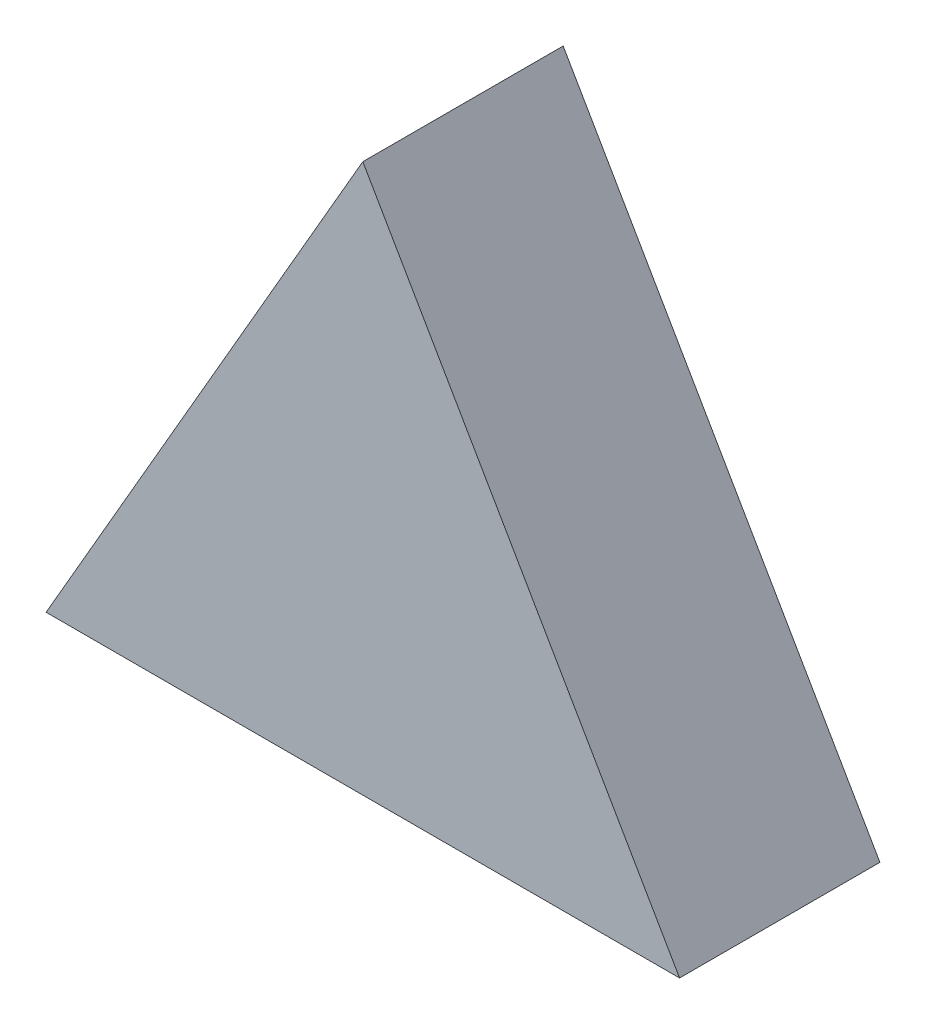
ISO-10303-21;
HEADER;
FILE_DESCRIPTION(('STEP AP214'),'2;1');
FILE_NAME('part.step','',(''),(''),'','','');
FILE_SCHEMA(('AUTOMOTIVE_DESIGN { 1 0 10303 214 1 1 1 1 }'));
ENDSEC;
DATA;
#1=APPLICATION_CONTEXT('core data for automotive mechanical design processes');
#2=APPLICATION_PROTOCOL_DEFINITION('international standard','automotive_design',2000,#1);
#3=PRODUCT_CONTEXT('',#1,'mechanical');
#4=PRODUCT('Part','Part','',(#3));
#5=PRODUCT_RELATED_PRODUCT_CATEGORY('part','',(#4));
#6=PRODUCT_DEFINITION_FORMATION('','',#4);
#7=PRODUCT_DEFINITION_CONTEXT('part definition',#1,'design');
#8=PRODUCT_DEFINITION('design','',#6,#7);
#9=PRODUCT_DEFINITION_SHAPE('','',#8);
#10=(LENGTH_UNIT() NAMED_UNIT(*) SI_UNIT(.MILLI.,.METRE.));
#11=(NAMED_UNIT(*) PLANE_ANGLE_UNIT() SI_UNIT($,.RADIAN.));
#12=(NAMED_UNIT(*) SI_UNIT($,.STERADIAN.) SOLID_ANGLE_UNIT());
#13=UNCERTAINTY_MEASURE_WITH_UNIT(LENGTH_MEASURE(1.E-05),#10,'distance_accuracy_value','');
#14=(GEOMETRIC_REPRESENTATION_CONTEXT(3) GLOBAL_UNCERTAINTY_ASSIGNED_CONTEXT((#13)) GLOBAL_UNIT_ASSIGNED_CONTEXT((#10,
#11,#12)) REPRESENTATION_CONTEXT('',''));
#15=CARTESIAN_POINT('',(0.,0.,0.));
#16=DIRECTION('',(0.,0.,1.));
#17=DIRECTION('',(1.,0.,0.));
#18=AXIS2_PLACEMENT_3D('',#15,#16,#17);
#19=CARTESIAN_POINT('',(101.6,-58.6587873496659,64.262));
#20=DIRECTION('',(-0.866025403784438,-0.5,0.));
#21=DIRECTION('',(0.5,-0.866025403784439,0.));
#22=AXIS2_PLACEMENT_3D('',#19,#20,#21);
#23=PLANE('',#22);
#24=DIRECTION('',(-0.5,0.866025403784438,0.));
#25=VECTOR('',#24,1.);
#26=CARTESIAN_POINT('',(101.6,-58.6587873496659,0.));
#27=LINE('',#26,#25);
#28=CARTESIAN_POINT('',(101.6,-58.6587873496659,0.));
#29=VERTEX_POINT('',#28);
#30=CARTESIAN_POINT('',(0.,117.317574699332,0.));
#31=VERTEX_POINT('',#30);
#32=EDGE_CURVE('E81',#29,#31,#27,.T.);
#33=ORIENTED_EDGE('',*,*,#32,.T.);
#34=DIRECTION('',(0.,0.,-1.));
#35=VECTOR('',#34,1.);
#36=CARTESIAN_POINT('',(0.,117.317574699332,64.262));
#37=LINE('',#36,#35);
#38=CARTESIAN_POINT('',(0.,117.317574699332,64.262));
#39=VERTEX_POINT('',#38);
#40=EDGE_CURVE('E11',#39,#31,#37,.T.);
#41=ORIENTED_EDGE('',*,*,#40,.F.);
#42=DIRECTION('',(-0.5,0.866025403784438,0.));
#43=VECTOR('',#42,1.);
#44=CARTESIAN_POINT('',(101.6,-58.6587873496659,64.262));
#45=LINE('',#44,#43);
#46=CARTESIAN_POINT('',(101.6,-58.6587873496659,64.262));
#47=VERTEX_POINT('',#46);
#48=EDGE_CURVE('E74',#47,#39,#45,.T.);
#49=ORIENTED_EDGE('',*,*,#48,.F.);
#50=DIRECTION('',(0.,0.,-1.));
#51=VECTOR('',#50,1.);
#52=CARTESIAN_POINT('',(101.6,-58.6587873496659,64.262));
#53=LINE('',#52,#51);
#54=EDGE_CURVE('E82',#47,#29,#53,.T.);
#55=ORIENTED_EDGE('',*,*,#54,.T.);
#56=EDGE_LOOP('',(#33,#41,#49,#55));
#57=FACE_BOUND('',#56,.T.);
#58=ADVANCED_FACE('F34',(#57),#23,.F.);
#59=CARTESIAN_POINT('',(0.,117.317574699332,64.262));
#60=DIRECTION('',(0.866025403784438,-0.5,0.));
#61=DIRECTION('',(0.5,0.866025403784439,0.));
#62=AXIS2_PLACEMENT_3D('',#59,#60,#61);
#63=PLANE('',#62);
#64=DIRECTION('',(-0.5,-0.866025403784439,0.));
#65=VECTOR('',#64,1.);
#66=CARTESIAN_POINT('',(0.,117.317574699332,0.));
#67=LINE('',#66,#65);
#68=CARTESIAN_POINT('',(-101.6,-58.658787349666,0.));
#69=VERTEX_POINT('',#68);
#70=EDGE_CURVE('E62',#31,#69,#67,.T.);
#71=ORIENTED_EDGE('',*,*,#70,.T.);
#72=DIRECTION('',(0.,0.,-1.));
#73=VECTOR('',#72,1.);
#74=CARTESIAN_POINT('',(-101.6,-58.658787349666,64.262));
#75=LINE('',#74,#73);
#76=CARTESIAN_POINT('',(-101.6,-58.658787349666,64.262));
#77=VERTEX_POINT('',#76);
#78=EDGE_CURVE('E42',#77,#69,#75,.T.);
#79=ORIENTED_EDGE('',*,*,#78,.F.);
#80=DIRECTION('',(-0.5,-0.866025403784439,0.));
#81=VECTOR('',#80,1.);
#82=CARTESIAN_POINT('',(0.,117.317574699332,64.262));
#83=LINE('',#82,#81);
#84=EDGE_CURVE('E70',#39,#77,#83,.T.);
#85=ORIENTED_EDGE('',*,*,#84,.F.);
#86=ORIENTED_EDGE('',*,*,#40,.T.);
#87=EDGE_LOOP('',(#71,#79,#85,#86));
#88=FACE_BOUND('',#87,.T.);
#89=ADVANCED_FACE('F71',(#88),#63,.F.);
#90=CARTESIAN_POINT('',(-101.6,-58.658787349666,64.262));
#91=DIRECTION('',(0.,1.,0.));
#92=DIRECTION('',(-1.,0.,0.));
#93=AXIS2_PLACEMENT_3D('',#90,#91,#92);
#94=PLANE('',#93);
#95=DIRECTION('',(1.,0.,0.));
#96=VECTOR('',#95,1.);
#97=CARTESIAN_POINT('',(-101.6,-58.658787349666,0.));
#98=LINE('',#97,#96);
#99=EDGE_CURVE('E67',#69,#29,#98,.T.);
#100=ORIENTED_EDGE('',*,*,#99,.T.);
#101=ORIENTED_EDGE('',*,*,#54,.F.);
#102=DIRECTION('',(1.,0.,0.));
#103=VECTOR('',#102,1.);
#104=CARTESIAN_POINT('',(-101.6,-58.658787349666,64.262));
#105=LINE('',#104,#103);
#106=EDGE_CURVE('E50',#77,#47,#105,.T.);
#107=ORIENTED_EDGE('',*,*,#106,.F.);
#108=ORIENTED_EDGE('',*,*,#78,.T.);
#109=EDGE_LOOP('',(#100,#101,#107,#108));
#110=FACE_BOUND('',#109,.T.);
#111=ADVANCED_FACE('F89',(#110),#94,.F.);
#112=CARTESIAN_POINT('',(0.,0.,64.262));
#113=DIRECTION('',(0.,0.,1.));
#114=DIRECTION('',(1.,0.,0.));
#115=AXIS2_PLACEMENT_3D('',#112,#113,#114);
#116=PLANE('',#115);
#117=ORIENTED_EDGE('',*,*,#48,.T.);
#118=ORIENTED_EDGE('',*,*,#84,.T.);
#119=ORIENTED_EDGE('',*,*,#106,.T.);
#120=EDGE_LOOP('',(#117,#118,#119));
#121=FACE_BOUND('',#120,.T.);
#122=ADVANCED_FACE('F77',(#121),#116,.T.);
#123=CARTESIAN_POINT('',(0.,0.,0.));
#124=DIRECTION('',(0.,0.,1.));
#125=DIRECTION('',(1.,0.,0.));
#126=AXIS2_PLACEMENT_3D('',#123,#124,#125);
#127=PLANE('',#126);
#128=ORIENTED_EDGE('',*,*,#32,.F.);
#129=ORIENTED_EDGE('',*,*,#99,.F.);
#130=ORIENTED_EDGE('',*,*,#70,.F.);
#131=EDGE_LOOP('',(#128,#129,#130));
#132=FACE_BOUND('',#131,.T.);
#133=ADVANCED_FACE('F90',(#132),#127,.F.);
#134=CLOSED_SHELL('',(#58,#89,#111,#122,#133));
#135=MANIFOLD_SOLID_BREP('B2',#134);
#136=ADVANCED_BREP_SHAPE_REPRESENTATION('',(#18,#135),#14);
#137=SHAPE_DEFINITION_REPRESENTATION(#9,#136);
ENDSEC;
END-ISO-10303-21;
